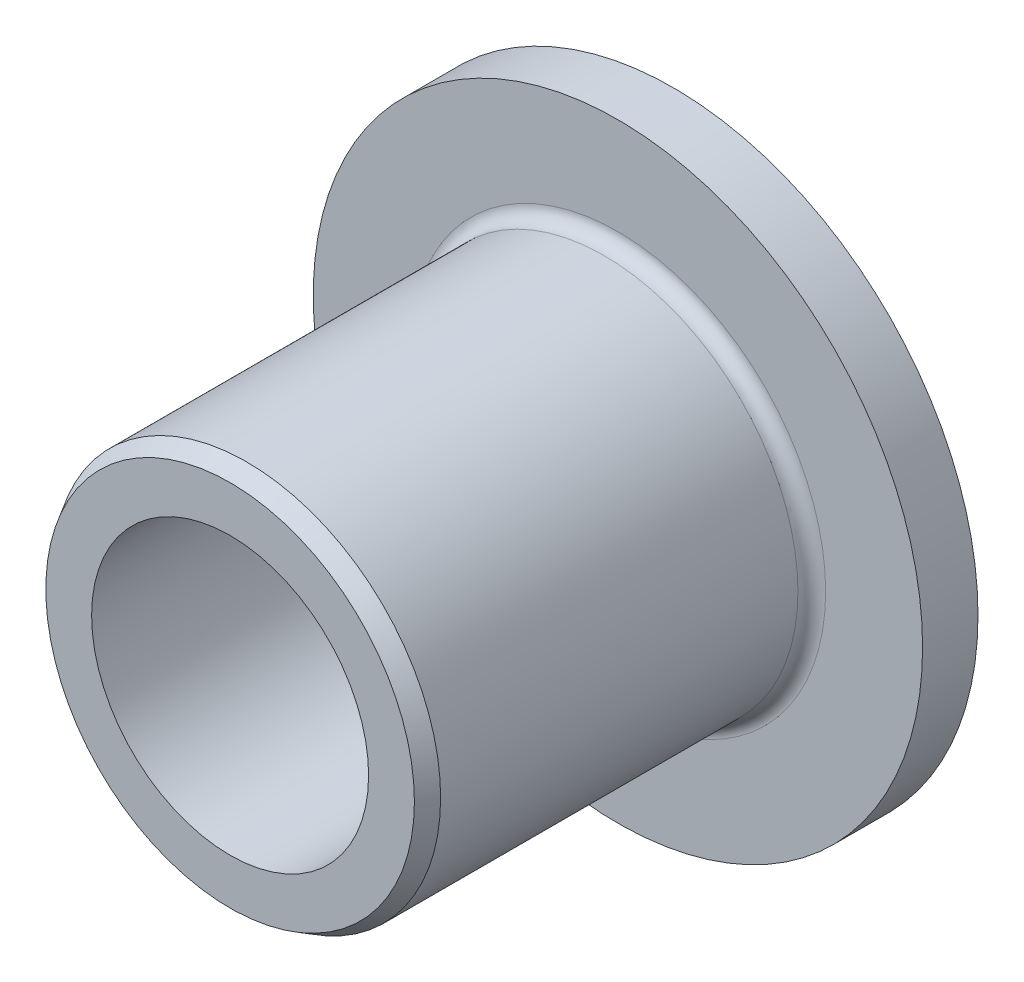
ISO-10303-21;
HEADER;
FILE_DESCRIPTION(('STEP AP214'),'2;1');
FILE_NAME('part.step','',(''),(''),'','','');
FILE_SCHEMA(('AUTOMOTIVE_DESIGN { 1 0 10303 214 1 1 1 1 }'));
ENDSEC;
DATA;
#1=APPLICATION_CONTEXT('core data for automotive mechanical design processes');
#2=APPLICATION_PROTOCOL_DEFINITION('international standard','automotive_design',2000,#1);
#3=PRODUCT_CONTEXT('',#1,'mechanical');
#4=PRODUCT('Part','Part','',(#3));
#5=PRODUCT_RELATED_PRODUCT_CATEGORY('part','',(#4));
#6=PRODUCT_DEFINITION_FORMATION('','',#4);
#7=PRODUCT_DEFINITION_CONTEXT('part definition',#1,'design');
#8=PRODUCT_DEFINITION('design','',#6,#7);
#9=PRODUCT_DEFINITION_SHAPE('','',#8);
#10=(LENGTH_UNIT() NAMED_UNIT(*) SI_UNIT(.MILLI.,.METRE.));
#11=(NAMED_UNIT(*) PLANE_ANGLE_UNIT() SI_UNIT($,.RADIAN.));
#12=(NAMED_UNIT(*) SI_UNIT($,.STERADIAN.) SOLID_ANGLE_UNIT());
#13=UNCERTAINTY_MEASURE_WITH_UNIT(LENGTH_MEASURE(1.E-05),#10,'distance_accuracy_value','');
#14=(GEOMETRIC_REPRESENTATION_CONTEXT(3) GLOBAL_UNCERTAINTY_ASSIGNED_CONTEXT((#13)) GLOBAL_UNIT_ASSIGNED_CONTEXT((#10,
#11,#12)) REPRESENTATION_CONTEXT('',''));
#15=CARTESIAN_POINT('',(0.,0.,0.));
#16=DIRECTION('',(0.,0.,1.));
#17=DIRECTION('',(1.,0.,0.));
#18=AXIS2_PLACEMENT_3D('',#15,#16,#17);
#19=CARTESIAN_POINT('',(0.,0.,0.));
#20=DIRECTION('',(0.,0.,1.));
#21=DIRECTION('',(1.,0.,0.));
#22=AXIS2_PLACEMENT_3D('',#19,#20,#21);
#23=CYLINDRICAL_SURFACE('',#22,3.5);
#24=CARTESIAN_POINT('',(0.,0.,1.25));
#25=DIRECTION('',(0.,0.,1.));
#26=DIRECTION('',(1.,0.,0.));
#27=AXIS2_PLACEMENT_3D('',#24,#25,#26);
#28=CIRCLE('',#27,3.5);
#29=CARTESIAN_POINT('',(3.5,0.,1.25));
#30=VERTEX_POINT('',#29);
#31=EDGE_CURVE('E51',#30,#30,#28,.T.);
#32=ORIENTED_EDGE('',*,*,#31,.T.);
#33=EDGE_LOOP('',(#32));
#34=FACE_BOUND('',#33,.T.);
#35=CARTESIAN_POINT('',(0.,0.,7.7));
#36=DIRECTION('',(0.,0.,1.));
#37=DIRECTION('',(1.,0.,0.));
#38=AXIS2_PLACEMENT_3D('',#35,#36,#37);
#39=CIRCLE('',#38,3.5);
#40=CARTESIAN_POINT('',(3.5,0.,7.7));
#41=VERTEX_POINT('',#40);
#42=EDGE_CURVE('E56',#41,#41,#39,.T.);
#43=ORIENTED_EDGE('',*,*,#42,.F.);
#44=EDGE_LOOP('',(#43));
#45=FACE_BOUND('',#44,.T.);
#46=ADVANCED_FACE('F43',(#34,#45),#23,.T.);
#47=CARTESIAN_POINT('',(0.,0.,8.));
#48=DIRECTION('',(0.,0.,-1.));
#49=DIRECTION('',(-1.,0.,0.));
#50=AXIS2_PLACEMENT_3D('',#47,#48,#49);
#51=CONICAL_SURFACE('',#50,3.32679491924311,0.523598775598298);
#52=ORIENTED_EDGE('',*,*,#42,.T.);
#53=EDGE_LOOP('',(#52));
#54=FACE_BOUND('',#53,.T.);
#55=CARTESIAN_POINT('',(0.,0.,8.));
#56=DIRECTION('',(0.,0.,1.));
#57=DIRECTION('',(1.,0.,0.));
#58=AXIS2_PLACEMENT_3D('',#55,#56,#57);
#59=CIRCLE('',#58,3.32679491924311);
#60=CARTESIAN_POINT('',(3.32679491924311,0.,8.));
#61=VERTEX_POINT('',#60);
#62=EDGE_CURVE('E61',#61,#61,#59,.T.);
#63=ORIENTED_EDGE('',*,*,#62,.F.);
#64=EDGE_LOOP('',(#63));
#65=FACE_BOUND('',#64,.T.);
#66=ADVANCED_FACE('F100',(#54,#65),#51,.T.);
#67=CARTESIAN_POINT('',(2.5,0.,8.));
#68=DIRECTION('',(0.,0.,1.));
#69=DIRECTION('',(1.,0.,0.));
#70=AXIS2_PLACEMENT_3D('',#67,#68,#69);
#71=PLANE('',#70);
#72=ORIENTED_EDGE('',*,*,#62,.T.);
#73=EDGE_LOOP('',(#72));
#74=FACE_BOUND('',#73,.T.);
#75=CARTESIAN_POINT('',(0.,0.,8.));
#76=DIRECTION('',(0.,0.,1.));
#77=DIRECTION('',(1.,0.,0.));
#78=AXIS2_PLACEMENT_3D('',#75,#76,#77);
#79=CIRCLE('',#78,2.5);
#80=CARTESIAN_POINT('',(2.5,0.,8.));
#81=VERTEX_POINT('',#80);
#82=EDGE_CURVE('E67',#81,#81,#79,.T.);
#83=ORIENTED_EDGE('',*,*,#82,.F.);
#84=EDGE_LOOP('',(#83));
#85=FACE_BOUND('',#84,.T.);
#86=ADVANCED_FACE('F104',(#74,#85),#71,.T.);
#87=CARTESIAN_POINT('',(0.,0.,0.));
#88=DIRECTION('',(0.,0.,1.));
#89=DIRECTION('',(1.,0.,0.));
#90=AXIS2_PLACEMENT_3D('',#87,#88,#89);
#91=CYLINDRICAL_SURFACE('',#90,2.5);
#92=ORIENTED_EDGE('',*,*,#82,.T.);
#93=EDGE_LOOP('',(#92));
#94=FACE_BOUND('',#93,.T.);
#95=CARTESIAN_POINT('',(0.,0.,0.));
#96=DIRECTION('',(0.,0.,1.));
#97=DIRECTION('',(1.,0.,0.));
#98=AXIS2_PLACEMENT_3D('',#95,#96,#97);
#99=CIRCLE('',#98,2.5);
#100=CARTESIAN_POINT('',(2.5,0.,0.));
#101=VERTEX_POINT('',#100);
#102=EDGE_CURVE('E71',#101,#101,#99,.T.);
#103=ORIENTED_EDGE('',*,*,#102,.F.);
#104=EDGE_LOOP('',(#103));
#105=FACE_BOUND('',#104,.T.);
#106=ADVANCED_FACE('F97',(#94,#105),#91,.F.);
#107=CARTESIAN_POINT('',(5.5,0.,0.));
#108=DIRECTION('',(0.,0.,-1.));
#109=DIRECTION('',(-1.,0.,0.));
#110=AXIS2_PLACEMENT_3D('',#107,#108,#109);
#111=PLANE('',#110);
#112=ORIENTED_EDGE('',*,*,#102,.T.);
#113=EDGE_LOOP('',(#112));
#114=FACE_BOUND('',#113,.T.);
#115=CARTESIAN_POINT('',(0.,0.,0.));
#116=DIRECTION('',(0.,0.,1.));
#117=DIRECTION('',(1.,0.,0.));
#118=AXIS2_PLACEMENT_3D('',#115,#116,#117);
#119=CIRCLE('',#118,5.5);
#120=CARTESIAN_POINT('',(5.5,0.,0.));
#121=VERTEX_POINT('',#120);
#122=EDGE_CURVE('E75',#121,#121,#119,.T.);
#123=ORIENTED_EDGE('',*,*,#122,.F.);
#124=EDGE_LOOP('',(#123));
#125=FACE_BOUND('',#124,.T.);
#126=ADVANCED_FACE('F88',(#114,#125),#111,.T.);
#127=CARTESIAN_POINT('',(0.,0.,0.));
#128=DIRECTION('',(0.,0.,1.));
#129=DIRECTION('',(1.,0.,0.));
#130=AXIS2_PLACEMENT_3D('',#127,#128,#129);
#131=CYLINDRICAL_SURFACE('',#130,5.5);
#132=ORIENTED_EDGE('',*,*,#122,.T.);
#133=EDGE_LOOP('',(#132));
#134=FACE_BOUND('',#133,.T.);
#135=CARTESIAN_POINT('',(0.,0.,1.));
#136=DIRECTION('',(0.,0.,1.));
#137=DIRECTION('',(1.,0.,0.));
#138=AXIS2_PLACEMENT_3D('',#135,#136,#137);
#139=CIRCLE('',#138,5.5);
#140=CARTESIAN_POINT('',(5.5,0.,1.));
#141=VERTEX_POINT('',#140);
#142=EDGE_CURVE('E79',#141,#141,#139,.T.);
#143=ORIENTED_EDGE('',*,*,#142,.F.);
#144=EDGE_LOOP('',(#143));
#145=FACE_BOUND('',#144,.T.);
#146=ADVANCED_FACE('F86',(#134,#145),#131,.T.);
#147=CARTESIAN_POINT('',(3.5,0.,1.));
#148=DIRECTION('',(0.,0.,1.));
#149=DIRECTION('',(1.,0.,0.));
#150=AXIS2_PLACEMENT_3D('',#147,#148,#149);
#151=PLANE('',#150);
#152=CARTESIAN_POINT('',(0.,0.,1.));
#153=DIRECTION('',(0.,0.,1.));
#154=DIRECTION('',(1.,0.,0.));
#155=AXIS2_PLACEMENT_3D('',#152,#153,#154);
#156=CIRCLE('',#155,3.75);
#157=CARTESIAN_POINT('',(3.75,0.,1.));
#158=VERTEX_POINT('',#157);
#159=EDGE_CURVE('E10',#158,#158,#156,.F.);
#160=ORIENTED_EDGE('',*,*,#159,.T.);
#161=EDGE_LOOP('',(#160));
#162=FACE_BOUND('',#161,.T.);
#163=ORIENTED_EDGE('',*,*,#142,.T.);
#164=EDGE_LOOP('',(#163));
#165=FACE_BOUND('',#164,.T.);
#166=ADVANCED_FACE('F84',(#162,#165),#151,.T.);
#167=CARTESIAN_POINT('',(0.,0.,1.25));
#168=DIRECTION('',(0.,0.,1.));
#169=DIRECTION('',(1.,0.,0.));
#170=AXIS2_PLACEMENT_3D('',#167,#168,#169);
#171=TOROIDAL_SURFACE('',#170,3.75,0.25);
#172=ORIENTED_EDGE('',*,*,#159,.F.);
#173=EDGE_LOOP('',(#172));
#174=FACE_BOUND('',#173,.T.);
#175=ORIENTED_EDGE('',*,*,#31,.F.);
#176=EDGE_LOOP('',(#175));
#177=FACE_BOUND('',#176,.T.);
#178=ADVANCED_FACE('F45',(#174,#177),#171,.F.);
#179=CLOSED_SHELL('',(#46,#66,#86,#106,#126,#146,#166,#178));
#180=MANIFOLD_SOLID_BREP('B2',#179);
#181=ADVANCED_BREP_SHAPE_REPRESENTATION('',(#18,#180),#14);
#182=SHAPE_DEFINITION_REPRESENTATION(#9,#181);
ENDSEC;
END-ISO-10303-21;
